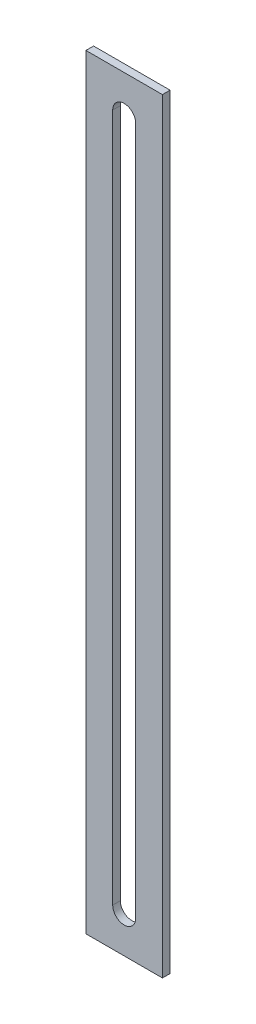
ISO-10303-21;
HEADER;
FILE_DESCRIPTION(('STEP AP214'),'2;1');
FILE_NAME('part.step','',(''),(''),'','','');
FILE_SCHEMA(('AUTOMOTIVE_DESIGN { 1 0 10303 214 1 1 1 1 }'));
ENDSEC;
DATA;
#1=APPLICATION_CONTEXT('core data for automotive mechanical design processes');
#2=APPLICATION_PROTOCOL_DEFINITION('international standard','automotive_design',2000,#1);
#3=PRODUCT_CONTEXT('',#1,'mechanical');
#4=PRODUCT('Part','Part','',(#3));
#5=PRODUCT_RELATED_PRODUCT_CATEGORY('part','',(#4));
#6=PRODUCT_DEFINITION_FORMATION('','',#4);
#7=PRODUCT_DEFINITION_CONTEXT('part definition',#1,'design');
#8=PRODUCT_DEFINITION('design','',#6,#7);
#9=PRODUCT_DEFINITION_SHAPE('','',#8);
#10=(LENGTH_UNIT() NAMED_UNIT(*) SI_UNIT(.MILLI.,.METRE.));
#11=(NAMED_UNIT(*) PLANE_ANGLE_UNIT() SI_UNIT($,.RADIAN.));
#12=(NAMED_UNIT(*) SI_UNIT($,.STERADIAN.) SOLID_ANGLE_UNIT());
#13=UNCERTAINTY_MEASURE_WITH_UNIT(LENGTH_MEASURE(1.E-05),#10,'distance_accuracy_value','');
#14=(GEOMETRIC_REPRESENTATION_CONTEXT(3) GLOBAL_UNCERTAINTY_ASSIGNED_CONTEXT((#13)) GLOBAL_UNIT_ASSIGNED_CONTEXT((#10,
#11,#12)) REPRESENTATION_CONTEXT('',''));
#15=CARTESIAN_POINT('',(0.,0.,0.));
#16=DIRECTION('',(0.,0.,1.));
#17=DIRECTION('',(1.,0.,0.));
#18=AXIS2_PLACEMENT_3D('',#15,#16,#17);
#19=CARTESIAN_POINT('',(-5.,-95.,1.));
#20=DIRECTION('',(0.,0.,1.));
#21=DIRECTION('',(1.,0.,0.));
#22=AXIS2_PLACEMENT_3D('',#19,#20,#21);
#23=PLANE('',#22);
#24=DIRECTION('',(0.,1.,0.));
#25=VECTOR('',#24,1.);
#26=CARTESIAN_POINT('',(1.5,-45.,1.));
#27=LINE('',#26,#25);
#28=CARTESIAN_POINT('',(1.5,-90.0000000003077,1.));
#29=VERTEX_POINT('',#28);
#30=CARTESIAN_POINT('',(1.5,-3.07657645065694E-10,1.));
#31=VERTEX_POINT('',#30);
#32=EDGE_CURVE('E65',#29,#31,#27,.T.);
#33=ORIENTED_EDGE('',*,*,#32,.F.);
#34=CARTESIAN_POINT('',(0.,-90.,1.));
#35=DIRECTION('',(0.,0.,-1.));
#36=DIRECTION('',(-1.,0.,0.));
#37=AXIS2_PLACEMENT_3D('',#34,#35,#36);
#38=CIRCLE('',#37,1.5);
#39=CARTESIAN_POINT('',(-1.5,-90.,1.));
#40=VERTEX_POINT('',#39);
#41=EDGE_CURVE('E21',#40,#29,#38,.F.);
#42=ORIENTED_EDGE('',*,*,#41,.F.);
#43=DIRECTION('',(0.,-1.,0.));
#44=VECTOR('',#43,1.);
#45=CARTESIAN_POINT('',(-1.5,-45.,1.));
#46=LINE('',#45,#44);
#47=CARTESIAN_POINT('',(-1.5,0.,1.));
#48=VERTEX_POINT('',#47);
#49=EDGE_CURVE('E110',#48,#40,#46,.T.);
#50=ORIENTED_EDGE('',*,*,#49,.F.);
#51=CARTESIAN_POINT('',(0.,0.,1.));
#52=DIRECTION('',(0.,0.,-1.));
#53=DIRECTION('',(-1.,0.,0.));
#54=AXIS2_PLACEMENT_3D('',#51,#52,#53);
#55=CIRCLE('',#54,1.5);
#56=EDGE_CURVE('E124',#31,#48,#55,.F.);
#57=ORIENTED_EDGE('',*,*,#56,.F.);
#58=EDGE_LOOP('',(#33,#42,#50,#57));
#59=FACE_BOUND('',#58,.T.);
#60=DIRECTION('',(0.,1.,0.));
#61=VECTOR('',#60,1.);
#62=CARTESIAN_POINT('',(5.,-45.,1.));
#63=LINE('',#62,#61);
#64=CARTESIAN_POINT('',(5.,-95.,1.));
#65=VERTEX_POINT('',#64);
#66=CARTESIAN_POINT('',(5.,5.,1.));
#67=VERTEX_POINT('',#66);
#68=EDGE_CURVE('E83',#65,#67,#63,.T.);
#69=ORIENTED_EDGE('',*,*,#68,.T.);
#70=DIRECTION('',(-1.,0.,0.));
#71=VECTOR('',#70,1.);
#72=CARTESIAN_POINT('',(0.,5.,1.));
#73=LINE('',#72,#71);
#74=CARTESIAN_POINT('',(-5.,5.,1.));
#75=VERTEX_POINT('',#74);
#76=EDGE_CURVE('E106',#67,#75,#73,.T.);
#77=ORIENTED_EDGE('',*,*,#76,.T.);
#78=DIRECTION('',(0.,-1.,0.));
#79=VECTOR('',#78,1.);
#80=CARTESIAN_POINT('',(-5.,-45.,1.));
#81=LINE('',#80,#79);
#82=CARTESIAN_POINT('',(-5.,-95.,1.));
#83=VERTEX_POINT('',#82);
#84=EDGE_CURVE('E74',#75,#83,#81,.T.);
#85=ORIENTED_EDGE('',*,*,#84,.T.);
#86=DIRECTION('',(1.,0.,0.));
#87=VECTOR('',#86,1.);
#88=CARTESIAN_POINT('',(0.,-95.,1.));
#89=LINE('',#88,#87);
#90=EDGE_CURVE('E85',#83,#65,#89,.T.);
#91=ORIENTED_EDGE('',*,*,#90,.T.);
#92=EDGE_LOOP('',(#69,#77,#85,#91));
#93=FACE_BOUND('',#92,.T.);
#94=ADVANCED_FACE('F17',(#59,#93),#23,.T.);
#95=CARTESIAN_POINT('',(-5.,-95.,0.));
#96=DIRECTION('',(0.,1.,0.));
#97=DIRECTION('',(0.,0.,1.));
#98=AXIS2_PLACEMENT_3D('',#95,#96,#97);
#99=PLANE('',#98);
#100=DIRECTION('',(0.,0.,1.));
#101=VECTOR('',#100,1.);
#102=CARTESIAN_POINT('',(5.,-95.,0.5));
#103=LINE('',#102,#101);
#104=CARTESIAN_POINT('',(5.,-95.,0.));
#105=VERTEX_POINT('',#104);
#106=EDGE_CURVE('E90',#105,#65,#103,.T.);
#107=ORIENTED_EDGE('',*,*,#106,.T.);
#108=ORIENTED_EDGE('',*,*,#90,.F.);
#109=DIRECTION('',(0.,0.,-1.));
#110=VECTOR('',#109,1.);
#111=CARTESIAN_POINT('',(-5.,-95.,0.5));
#112=LINE('',#111,#110);
#113=CARTESIAN_POINT('',(-5.,-95.,0.));
#114=VERTEX_POINT('',#113);
#115=EDGE_CURVE('E115',#83,#114,#112,.T.);
#116=ORIENTED_EDGE('',*,*,#115,.T.);
#117=DIRECTION('',(1.,0.,0.));
#118=VECTOR('',#117,1.);
#119=CARTESIAN_POINT('',(0.,-95.,0.));
#120=LINE('',#119,#118);
#121=EDGE_CURVE('E96',#114,#105,#120,.T.);
#122=ORIENTED_EDGE('',*,*,#121,.T.);
#123=EDGE_LOOP('',(#107,#108,#116,#122));
#124=FACE_BOUND('',#123,.T.);
#125=ADVANCED_FACE('F94',(#124),#99,.F.);
#126=CARTESIAN_POINT('',(5.,5.,0.));
#127=DIRECTION('',(-1.,0.,0.));
#128=DIRECTION('',(0.,-1.,0.));
#129=AXIS2_PLACEMENT_3D('',#126,#127,#128);
#130=PLANE('',#129);
#131=DIRECTION('',(0.,0.,1.));
#132=VECTOR('',#131,1.);
#133=CARTESIAN_POINT('',(5.,5.,0.5));
#134=LINE('',#133,#132);
#135=CARTESIAN_POINT('',(5.,5.,0.));
#136=VERTEX_POINT('',#135);
#137=EDGE_CURVE('E103',#136,#67,#134,.T.);
#138=ORIENTED_EDGE('',*,*,#137,.T.);
#139=ORIENTED_EDGE('',*,*,#68,.F.);
#140=ORIENTED_EDGE('',*,*,#106,.F.);
#141=DIRECTION('',(0.,1.,0.));
#142=VECTOR('',#141,1.);
#143=CARTESIAN_POINT('',(5.,-45.,0.));
#144=LINE('',#143,#142);
#145=EDGE_CURVE('E155',#105,#136,#144,.T.);
#146=ORIENTED_EDGE('',*,*,#145,.T.);
#147=EDGE_LOOP('',(#138,#139,#140,#146));
#148=FACE_BOUND('',#147,.T.);
#149=ADVANCED_FACE('F101',(#148),#130,.F.);
#150=CARTESIAN_POINT('',(-5.,5.,1.));
#151=DIRECTION('',(0.,-1.,0.));
#152=DIRECTION('',(0.,0.,-1.));
#153=AXIS2_PLACEMENT_3D('',#150,#151,#152);
#154=PLANE('',#153);
#155=DIRECTION('',(0.,0.,1.));
#156=VECTOR('',#155,1.);
#157=CARTESIAN_POINT('',(-5.,5.,0.5));
#158=LINE('',#157,#156);
#159=CARTESIAN_POINT('',(-5.,5.,0.));
#160=VERTEX_POINT('',#159);
#161=EDGE_CURVE('E139',#160,#75,#158,.T.);
#162=ORIENTED_EDGE('',*,*,#161,.T.);
#163=ORIENTED_EDGE('',*,*,#76,.F.);
#164=ORIENTED_EDGE('',*,*,#137,.F.);
#165=DIRECTION('',(-1.,0.,0.));
#166=VECTOR('',#165,1.);
#167=CARTESIAN_POINT('',(0.,5.,0.));
#168=LINE('',#167,#166);
#169=EDGE_CURVE('E146',#136,#160,#168,.T.);
#170=ORIENTED_EDGE('',*,*,#169,.T.);
#171=EDGE_LOOP('',(#162,#163,#164,#170));
#172=FACE_BOUND('',#171,.T.);
#173=ADVANCED_FACE('F144',(#172),#154,.F.);
#174=CARTESIAN_POINT('',(-5.,-95.,0.));
#175=DIRECTION('',(1.,0.,0.));
#176=DIRECTION('',(0.,1.,0.));
#177=AXIS2_PLACEMENT_3D('',#174,#175,#176);
#178=PLANE('',#177);
#179=ORIENTED_EDGE('',*,*,#115,.F.);
#180=ORIENTED_EDGE('',*,*,#84,.F.);
#181=ORIENTED_EDGE('',*,*,#161,.F.);
#182=DIRECTION('',(0.,-1.,0.));
#183=VECTOR('',#182,1.);
#184=CARTESIAN_POINT('',(-5.,-45.,0.));
#185=LINE('',#184,#183);
#186=EDGE_CURVE('E151',#160,#114,#185,.T.);
#187=ORIENTED_EDGE('',*,*,#186,.T.);
#188=EDGE_LOOP('',(#179,#180,#181,#187));
#189=FACE_BOUND('',#188,.T.);
#190=ADVANCED_FACE('F150',(#189),#178,.F.);
#191=CARTESIAN_POINT('',(1.5,0.,0.));
#192=DIRECTION('',(-1.,0.,0.));
#193=DIRECTION('',(0.,-1.,0.));
#194=AXIS2_PLACEMENT_3D('',#191,#192,#193);
#195=PLANE('',#194);
#196=ORIENTED_EDGE('',*,*,#32,.T.);
#197=DIRECTION('',(0.,0.,-1.));
#198=VECTOR('',#197,1.);
#199=CARTESIAN_POINT('',(1.5,-6.15310285545994E-10,0.5));
#200=LINE('',#199,#198);
#201=CARTESIAN_POINT('',(1.5,-3.07655910342218E-10,0.));
#202=VERTEX_POINT('',#201);
#203=EDGE_CURVE('E127',#202,#31,#200,.F.);
#204=ORIENTED_EDGE('',*,*,#203,.F.);
#205=DIRECTION('',(0.,-1.,0.));
#206=VECTOR('',#205,1.);
#207=CARTESIAN_POINT('',(1.5,-45.,0.));
#208=LINE('',#207,#206);
#209=CARTESIAN_POINT('',(1.5,-90.0000000003077,0.));
#210=VERTEX_POINT('',#209);
#211=EDGE_CURVE('E123',#202,#210,#208,.T.);
#212=ORIENTED_EDGE('',*,*,#211,.T.);
#213=DIRECTION('',(0.,0.,1.));
#214=VECTOR('',#213,1.);
#215=CARTESIAN_POINT('',(1.5,-90.0000000006153,0.5));
#216=LINE('',#215,#214);
#217=EDGE_CURVE('E114',#29,#210,#216,.F.);
#218=ORIENTED_EDGE('',*,*,#217,.F.);
#219=EDGE_LOOP('',(#196,#204,#212,#218));
#220=FACE_BOUND('',#219,.T.);
#221=ADVANCED_FACE('F165',(#220),#195,.T.);
#222=CARTESIAN_POINT('',(0.,-90.,1.));
#223=DIRECTION('',(0.,0.,-1.));
#224=DIRECTION('',(-1.,0.,0.));
#225=AXIS2_PLACEMENT_3D('',#222,#223,#224);
#226=CYLINDRICAL_SURFACE('',#225,1.5);
#227=ORIENTED_EDGE('',*,*,#41,.T.);
#228=ORIENTED_EDGE('',*,*,#217,.T.);
#229=CARTESIAN_POINT('',(0.,-90.,0.));
#230=DIRECTION('',(0.,0.,-1.));
#231=DIRECTION('',(-1.,0.,0.));
#232=AXIS2_PLACEMENT_3D('',#229,#230,#231);
#233=CIRCLE('',#232,1.5);
#234=CARTESIAN_POINT('',(-1.5,-90.,0.));
#235=VERTEX_POINT('',#234);
#236=EDGE_CURVE('E122',#210,#235,#233,.T.);
#237=ORIENTED_EDGE('',*,*,#236,.T.);
#238=DIRECTION('',(0.,0.,-1.));
#239=VECTOR('',#238,1.);
#240=CARTESIAN_POINT('',(-1.5,-90.,0.5));
#241=LINE('',#240,#239);
#242=EDGE_CURVE('E113',#40,#235,#241,.T.);
#243=ORIENTED_EDGE('',*,*,#242,.F.);
#244=EDGE_LOOP('',(#227,#228,#237,#243));
#245=FACE_BOUND('',#244,.T.);
#246=ADVANCED_FACE('F170',(#245),#226,.F.);
#247=CARTESIAN_POINT('',(-1.5,-90.,0.));
#248=DIRECTION('',(1.,0.,0.));
#249=DIRECTION('',(0.,1.,0.));
#250=AXIS2_PLACEMENT_3D('',#247,#248,#249);
#251=PLANE('',#250);
#252=ORIENTED_EDGE('',*,*,#49,.T.);
#253=ORIENTED_EDGE('',*,*,#242,.T.);
#254=DIRECTION('',(0.,1.,0.));
#255=VECTOR('',#254,1.);
#256=CARTESIAN_POINT('',(-1.5,-45.,0.));
#257=LINE('',#256,#255);
#258=CARTESIAN_POINT('',(-1.5,0.,0.));
#259=VERTEX_POINT('',#258);
#260=EDGE_CURVE('E36',#235,#259,#257,.T.);
#261=ORIENTED_EDGE('',*,*,#260,.T.);
#262=DIRECTION('',(0.,0.,1.));
#263=VECTOR('',#262,1.);
#264=CARTESIAN_POINT('',(-1.5,0.,0.5));
#265=LINE('',#264,#263);
#266=EDGE_CURVE('E126',#48,#259,#265,.F.);
#267=ORIENTED_EDGE('',*,*,#266,.F.);
#268=EDGE_LOOP('',(#252,#253,#261,#267));
#269=FACE_BOUND('',#268,.T.);
#270=ADVANCED_FACE('F172',(#269),#251,.T.);
#271=CARTESIAN_POINT('',(0.,0.,1.));
#272=DIRECTION('',(0.,0.,-1.));
#273=DIRECTION('',(-1.,0.,0.));
#274=AXIS2_PLACEMENT_3D('',#271,#272,#273);
#275=CYLINDRICAL_SURFACE('',#274,1.5);
#276=ORIENTED_EDGE('',*,*,#56,.T.);
#277=ORIENTED_EDGE('',*,*,#266,.T.);
#278=CARTESIAN_POINT('',(0.,0.,0.));
#279=DIRECTION('',(0.,0.,-1.));
#280=DIRECTION('',(-1.,0.,0.));
#281=AXIS2_PLACEMENT_3D('',#278,#279,#280);
#282=CIRCLE('',#281,1.5);
#283=EDGE_CURVE('E119',#259,#202,#282,.T.);
#284=ORIENTED_EDGE('',*,*,#283,.T.);
#285=ORIENTED_EDGE('',*,*,#203,.T.);
#286=EDGE_LOOP('',(#276,#277,#284,#285));
#287=FACE_BOUND('',#286,.T.);
#288=ADVANCED_FACE('F171',(#287),#275,.F.);
#289=CARTESIAN_POINT('',(-5.,-95.,0.));
#290=DIRECTION('',(0.,0.,1.));
#291=DIRECTION('',(1.,0.,0.));
#292=AXIS2_PLACEMENT_3D('',#289,#290,#291);
#293=PLANE('',#292);
#294=CARTESIAN_POINT('',(0.,3.5,0.));
#295=DIRECTION('',(0.,0.,1.));
#296=DIRECTION('',(1.,0.,0.));
#297=AXIS2_PLACEMENT_3D('',#294,#295,#296);
#298=CIRCLE('',#297,0.5);
#299=CARTESIAN_POINT('',(0.5,3.5,0.));
#300=VERTEX_POINT('',#299);
#301=EDGE_CURVE('E27',#300,#300,#298,.T.);
#302=ORIENTED_EDGE('',*,*,#301,.T.);
#303=EDGE_LOOP('',(#302));
#304=FACE_BOUND('',#303,.T.);
#305=ORIENTED_EDGE('',*,*,#260,.F.);
#306=ORIENTED_EDGE('',*,*,#236,.F.);
#307=ORIENTED_EDGE('',*,*,#211,.F.);
#308=ORIENTED_EDGE('',*,*,#283,.F.);
#309=EDGE_LOOP('',(#305,#306,#307,#308));
#310=FACE_BOUND('',#309,.T.);
#311=ORIENTED_EDGE('',*,*,#169,.F.);
#312=ORIENTED_EDGE('',*,*,#145,.F.);
#313=ORIENTED_EDGE('',*,*,#121,.F.);
#314=ORIENTED_EDGE('',*,*,#186,.F.);
#315=EDGE_LOOP('',(#311,#312,#313,#314));
#316=FACE_BOUND('',#315,.T.);
#317=ADVANCED_FACE('F158',(#304,#310,#316),#293,.F.);
#318=CARTESIAN_POINT('',(0.506,2.994,-1.));
#319=DIRECTION('',(0.,0.,-1.));
#320=DIRECTION('',(-1.,0.,0.));
#321=AXIS2_PLACEMENT_3D('',#318,#319,#320);
#322=PLANE('',#321);
#323=CARTESIAN_POINT('',(0.,3.5,-1.));
#324=DIRECTION('',(0.,0.,1.));
#325=DIRECTION('',(1.,0.,0.));
#326=AXIS2_PLACEMENT_3D('',#323,#324,#325);
#327=CIRCLE('',#326,0.5);
#328=CARTESIAN_POINT('',(0.5,3.5,-1.));
#329=VERTEX_POINT('',#328);
#330=EDGE_CURVE('E11',#329,#329,#327,.F.);
#331=ORIENTED_EDGE('',*,*,#330,.T.);
#332=EDGE_LOOP('',(#331));
#333=FACE_BOUND('',#332,.T.);
#334=ADVANCED_FACE('F19',(#333),#322,.T.);
#335=CARTESIAN_POINT('',(0.,3.5,-1.));
#336=DIRECTION('',(0.,0.,1.));
#337=DIRECTION('',(1.,0.,0.));
#338=AXIS2_PLACEMENT_3D('',#335,#336,#337);
#339=CYLINDRICAL_SURFACE('',#338,0.5);
#340=ORIENTED_EDGE('',*,*,#301,.F.);
#341=EDGE_LOOP('',(#340));
#342=FACE_BOUND('',#341,.T.);
#343=ORIENTED_EDGE('',*,*,#330,.F.);
#344=EDGE_LOOP('',(#343));
#345=FACE_BOUND('',#344,.T.);
#346=ADVANCED_FACE('F181',(#342,#345),#339,.T.);
#347=CLOSED_SHELL('',(#94,#125,#149,#173,#190,#221,#246,#270,#288,#317,#334,#346));
#348=MANIFOLD_SOLID_BREP('B1',#347);
#349=ADVANCED_BREP_SHAPE_REPRESENTATION('',(#18,#348),#14);
#350=SHAPE_DEFINITION_REPRESENTATION(#9,#349);
ENDSEC;
END-ISO-10303-21;
